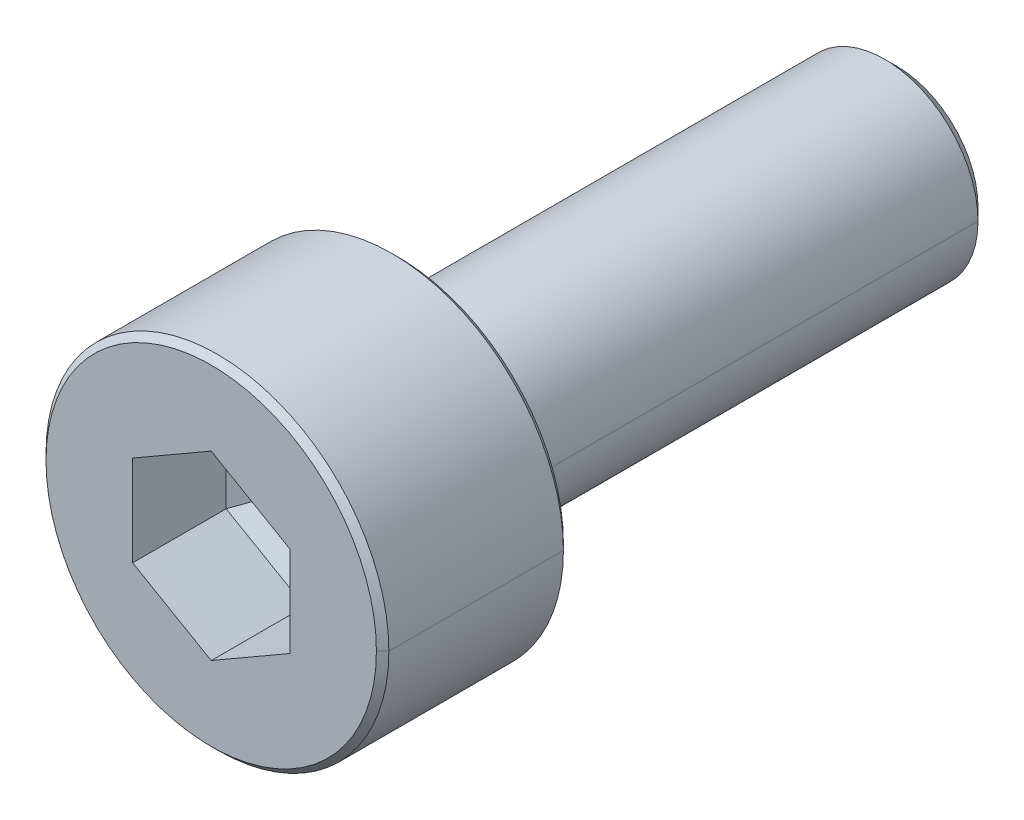
ISO-10303-21;
HEADER;
FILE_DESCRIPTION(('STEP AP214'),'2;1');
FILE_NAME('part.step','',(''),(''),'','','');
FILE_SCHEMA(('AUTOMOTIVE_DESIGN { 1 0 10303 214 1 1 1 1 }'));
ENDSEC;
DATA;
#1=APPLICATION_CONTEXT('core data for automotive mechanical design processes');
#2=APPLICATION_PROTOCOL_DEFINITION('international standard','automotive_design',2000,#1);
#3=PRODUCT_CONTEXT('',#1,'mechanical');
#4=PRODUCT('Part','Part','',(#3));
#5=PRODUCT_RELATED_PRODUCT_CATEGORY('part','',(#4));
#6=PRODUCT_DEFINITION_FORMATION('','',#4);
#7=PRODUCT_DEFINITION_CONTEXT('part definition',#1,'design');
#8=PRODUCT_DEFINITION('design','',#6,#7);
#9=PRODUCT_DEFINITION_SHAPE('','',#8);
#10=(LENGTH_UNIT() NAMED_UNIT(*) SI_UNIT(.MILLI.,.METRE.));
#11=(NAMED_UNIT(*) PLANE_ANGLE_UNIT() SI_UNIT($,.RADIAN.));
#12=(NAMED_UNIT(*) SI_UNIT($,.STERADIAN.) SOLID_ANGLE_UNIT());
#13=UNCERTAINTY_MEASURE_WITH_UNIT(LENGTH_MEASURE(1.E-05),#10,'distance_accuracy_value','');
#14=(GEOMETRIC_REPRESENTATION_CONTEXT(3) GLOBAL_UNCERTAINTY_ASSIGNED_CONTEXT((#13)) GLOBAL_UNIT_ASSIGNED_CONTEXT((#10,
#11,#12)) REPRESENTATION_CONTEXT('',''));
#15=CARTESIAN_POINT('',(0.,0.,0.));
#16=DIRECTION('',(0.,0.,1.));
#17=DIRECTION('',(1.,0.,0.));
#18=AXIS2_PLACEMENT_3D('',#15,#16,#17);
#19=CARTESIAN_POINT('',(0.,0.,8.));
#20=DIRECTION('',(0.,0.,1.));
#21=DIRECTION('',(1.,0.,0.));
#22=AXIS2_PLACEMENT_3D('',#19,#20,#21);
#23=CYLINDRICAL_SURFACE('',#22,2.75);
#24=DIRECTION('',(0.,0.,1.));
#25=VECTOR('',#24,1.);
#26=CARTESIAN_POINT('',(2.75000030173,5.595104737472E-10,8.099999698214));
#27=LINE('',#26,#25);
#28=CARTESIAN_POINT('',(2.75,0.,8.100000581692));
#29=VERTEX_POINT('',#28);
#30=CARTESIAN_POINT('',(2.75,0.,10.89999941831));
#31=VERTEX_POINT('',#30);
#32=EDGE_CURVE('E269',#29,#31,#27,.T.);
#33=ORIENTED_EDGE('',*,*,#32,.F.);
#34=CARTESIAN_POINT('',(0.,0.,8.100000581692));
#35=DIRECTION('',(0.,0.,-1.));
#36=DIRECTION('',(-1.,0.,0.));
#37=AXIS2_PLACEMENT_3D('',#34,#35,#36);
#38=CIRCLE('',#37,2.75);
#39=CARTESIAN_POINT('',(-2.75,0.,8.100000581692));
#40=VERTEX_POINT('',#39);
#41=EDGE_CURVE('E227',#40,#29,#38,.T.);
#42=ORIENTED_EDGE('',*,*,#41,.F.);
#43=DIRECTION('',(0.,0.,1.));
#44=VECTOR('',#43,1.);
#45=CARTESIAN_POINT('',(-2.75000030173,-5.595104746768E-10,8.099999698214));
#46=LINE('',#45,#44);
#47=CARTESIAN_POINT('',(-2.75,0.,10.89999941831));
#48=VERTEX_POINT('',#47);
#49=EDGE_CURVE('E299',#40,#48,#46,.T.);
#50=ORIENTED_EDGE('',*,*,#49,.T.);
#51=CARTESIAN_POINT('',(0.,0.,10.89999941831));
#52=DIRECTION('',(0.,0.,1.));
#53=DIRECTION('',(1.,0.,0.));
#54=AXIS2_PLACEMENT_3D('',#51,#52,#53);
#55=CIRCLE('',#54,2.75);
#56=EDGE_CURVE('E10',#31,#48,#55,.T.);
#57=ORIENTED_EDGE('',*,*,#56,.F.);
#58=EDGE_LOOP('',(#33,#42,#50,#57));
#59=FACE_BOUND('',#58,.T.);
#60=ADVANCED_FACE('F15',(#59),#23,.T.);
#61=CARTESIAN_POINT('',(0.,0.,10.95000050783));
#62=DIRECTION('',(0.,0.,-1.));
#63=DIRECTION('',(0.,-1.,0.));
#64=AXIS2_PLACEMENT_3D('',#61,#62,#63);
#65=CONICAL_SURFACE('',#64,2.700000677254,0.785398382857619);
#66=DIRECTION('',(0.707106173390536,-1.12696527626106E-09,-0.707107388982036));
#67=VECTOR('',#66,1.);
#68=CARTESIAN_POINT('',(2.650000387677,7.188872511511E-10,11.00000038775));
#69=LINE('',#68,#67);
#70=CARTESIAN_POINT('',(2.650000304246,0.,11.00000085889));
#71=VERTEX_POINT('',#70);
#72=EDGE_CURVE('E203',#71,#31,#69,.T.);
#73=ORIENTED_EDGE('',*,*,#72,.T.);
#74=ORIENTED_EDGE('',*,*,#56,.T.);
#75=DIRECTION('',(-0.707106173390536,1.12695886568306E-09,-0.707107388982036));
#76=VECTOR('',#75,1.);
#77=CARTESIAN_POINT('',(-2.650000387677,-7.188873169314E-10,11.00000038775));
#78=LINE('',#77,#76);
#79=CARTESIAN_POINT('',(-2.650000304246,0.,11.00000085889));
#80=VERTEX_POINT('',#79);
#81=EDGE_CURVE('E213',#80,#48,#78,.T.);
#82=ORIENTED_EDGE('',*,*,#81,.F.);
#83=CARTESIAN_POINT('',(0.,0.,11.00000085889));
#84=DIRECTION('',(0.,0.,1.));
#85=DIRECTION('',(1.,0.,0.));
#86=AXIS2_PLACEMENT_3D('',#83,#84,#85);
#87=CIRCLE('',#86,2.650000304246);
#88=EDGE_CURVE('E202',#71,#80,#87,.T.);
#89=ORIENTED_EDGE('',*,*,#88,.F.);
#90=EDGE_LOOP('',(#73,#74,#82,#89));
#91=FACE_BOUND('',#90,.T.);
#92=ADVANCED_FACE('F408',(#91),#65,.T.);
#93=CARTESIAN_POINT('',(0.,0.,8.75));
#94=DIRECTION('',(0.,0.,1.));
#95=DIRECTION('',(1.,0.,0.));
#96=AXIS2_PLACEMENT_3D('',#93,#94,#95);
#97=PLANE('',#96);
#98=DIRECTION('',(-0.866025403784429,0.500000000000017,0.));
#99=VECTOR('',#98,1.);
#100=CARTESIAN_POINT('',(0.08660254037844,0.05,8.75));
#101=LINE('',#100,#99);
#102=CARTESIAN_POINT('',(0.08660254037844,0.05,8.75));
#103=VERTEX_POINT('',#102);
#104=CARTESIAN_POINT('',(0.,0.1,8.75));
#105=VERTEX_POINT('',#104);
#106=EDGE_CURVE('E277',#103,#105,#101,.T.);
#107=ORIENTED_EDGE('',*,*,#106,.T.);
#108=DIRECTION('',(-0.866025403784429,-0.500000000000017,0.));
#109=VECTOR('',#108,1.);
#110=CARTESIAN_POINT('',(0.,0.1,8.75));
#111=LINE('',#110,#109);
#112=CARTESIAN_POINT('',(-0.08660254037844,0.05,8.75));
#113=VERTEX_POINT('',#112);
#114=EDGE_CURVE('E191',#105,#113,#111,.T.);
#115=ORIENTED_EDGE('',*,*,#114,.T.);
#116=DIRECTION('',(0.,-1.,0.));
#117=VECTOR('',#116,1.);
#118=CARTESIAN_POINT('',(-0.08660254037844,0.05,8.75));
#119=LINE('',#118,#117);
#120=CARTESIAN_POINT('',(-0.08660254037844,-0.05,8.75));
#121=VERTEX_POINT('',#120);
#122=EDGE_CURVE('E38',#113,#121,#119,.T.);
#123=ORIENTED_EDGE('',*,*,#122,.T.);
#124=DIRECTION('',(0.866025403784429,-0.500000000000017,0.));
#125=VECTOR('',#124,1.);
#126=CARTESIAN_POINT('',(-0.08660254037844,-0.05,8.75));
#127=LINE('',#126,#125);
#128=CARTESIAN_POINT('',(0.,-0.1,8.75));
#129=VERTEX_POINT('',#128);
#130=EDGE_CURVE('E221',#121,#129,#127,.T.);
#131=ORIENTED_EDGE('',*,*,#130,.T.);
#132=DIRECTION('',(0.866025403784429,0.500000000000017,0.));
#133=VECTOR('',#132,1.);
#134=CARTESIAN_POINT('',(0.,-0.1,8.75));
#135=LINE('',#134,#133);
#136=CARTESIAN_POINT('',(0.08660254037844,-0.05,8.75));
#137=VERTEX_POINT('',#136);
#138=EDGE_CURVE('E197',#129,#137,#135,.T.);
#139=ORIENTED_EDGE('',*,*,#138,.T.);
#140=DIRECTION('',(0.,1.,0.));
#141=VECTOR('',#140,1.);
#142=CARTESIAN_POINT('',(0.08660254037844,-0.05,8.75));
#143=LINE('',#142,#141);
#144=EDGE_CURVE('E244',#137,#103,#143,.T.);
#145=ORIENTED_EDGE('',*,*,#144,.T.);
#146=EDGE_LOOP('',(#107,#115,#123,#131,#139,#145));
#147=FACE_BOUND('',#146,.T.);
#148=ADVANCED_FACE('F413',(#147),#97,.T.);
#149=CARTESIAN_POINT('',(-1.26,0.7274613391789,11.));
#150=DIRECTION('',(-1.,0.,0.));
#151=DIRECTION('',(0.,0.,1.));
#152=AXIS2_PLACEMENT_3D('',#149,#150,#151);
#153=PLANE('',#152);
#154=DIRECTION('',(0.,0.,-1.));
#155=VECTOR('',#154,1.);
#156=CARTESIAN_POINT('',(-1.26,0.7274613391789,11.));
#157=LINE('',#156,#155);
#158=CARTESIAN_POINT('',(-1.26,0.7274613391789,11.));
#159=VERTEX_POINT('',#158);
#160=CARTESIAN_POINT('',(-1.26,0.7274613391789,9.5));
#161=VERTEX_POINT('',#160);
#162=EDGE_CURVE('E149',#159,#161,#157,.T.);
#163=ORIENTED_EDGE('',*,*,#162,.F.);
#164=DIRECTION('',(0.,-1.,0.));
#165=VECTOR('',#164,1.);
#166=CARTESIAN_POINT('',(-1.26,0.7274613391789,11.));
#167=LINE('',#166,#165);
#168=CARTESIAN_POINT('',(-1.26,-0.7274613391789,11.));
#169=VERTEX_POINT('',#168);
#170=EDGE_CURVE('E154',#159,#169,#167,.T.);
#171=ORIENTED_EDGE('',*,*,#170,.T.);
#172=DIRECTION('',(0.,0.,-1.));
#173=VECTOR('',#172,1.);
#174=CARTESIAN_POINT('',(-1.26,-0.7274613391789,11.));
#175=LINE('',#174,#173);
#176=CARTESIAN_POINT('',(-1.26,-0.7274613391789,9.5));
#177=VERTEX_POINT('',#176);
#178=EDGE_CURVE('E222',#169,#177,#175,.T.);
#179=ORIENTED_EDGE('',*,*,#178,.T.);
#180=DIRECTION('',(0.,-1.,0.));
#181=VECTOR('',#180,1.);
#182=CARTESIAN_POINT('',(-1.26,0.7274613391789,9.5));
#183=LINE('',#182,#181);
#184=EDGE_CURVE('E25',#161,#177,#183,.T.);
#185=ORIENTED_EDGE('',*,*,#184,.F.);
#186=EDGE_LOOP('',(#163,#171,#179,#185));
#187=FACE_BOUND('',#186,.T.);
#188=ADVANCED_FACE('F151',(#187),#153,.F.);
#189=CARTESIAN_POINT('',(-0.6733012701892,0.,9.125));
#190=DIRECTION('',(-0.538557238596109,0.,-0.842588927506013));
#191=DIRECTION('',(-0.842588927506013,0.,0.538557238596109));
#192=AXIS2_PLACEMENT_3D('',#189,#190,#191);
#193=PLANE('',#192);
#194=DIRECTION('',(-0.757690757673019,-0.437452962905011,0.484292908251312));
#195=VECTOR('',#194,1.);
#196=CARTESIAN_POINT('',(-0.08660254037844,-0.05,8.75));
#197=LINE('',#196,#195);
#198=EDGE_CURVE('E276',#121,#177,#197,.T.);
#199=ORIENTED_EDGE('',*,*,#198,.F.);
#200=ORIENTED_EDGE('',*,*,#122,.F.);
#201=DIRECTION('',(-0.757690757673019,0.437452962905011,0.484292908251312));
#202=VECTOR('',#201,1.);
#203=CARTESIAN_POINT('',(-0.08660254037844,0.05,8.75));
#204=LINE('',#203,#202);
#205=EDGE_CURVE('E188',#113,#161,#204,.T.);
#206=ORIENTED_EDGE('',*,*,#205,.T.);
#207=ORIENTED_EDGE('',*,*,#184,.T.);
#208=EDGE_LOOP('',(#199,#200,#206,#207));
#209=FACE_BOUND('',#208,.T.);
#210=ADVANCED_FACE('F467',(#209),#193,.F.);
#211=CARTESIAN_POINT('',(-0.3366506350946,-0.5830960043842,9.125));
#212=DIRECTION('',(-0.269278619298103,-0.466404250016206,-0.84258892750601));
#213=DIRECTION('',(0.,-0.874905925810061,0.484292908251236));
#214=AXIS2_PLACEMENT_3D('',#211,#212,#213);
#215=PLANE('',#214);
#216=DIRECTION('',(0.,-0.87490592581002,0.484292908251311));
#217=VECTOR('',#216,1.);
#218=CARTESIAN_POINT('',(0.,-0.1,8.75));
#219=LINE('',#218,#217);
#220=CARTESIAN_POINT('',(0.,-1.454922678358,9.5));
#221=VERTEX_POINT('',#220);
#222=EDGE_CURVE('E192',#129,#221,#219,.T.);
#223=ORIENTED_EDGE('',*,*,#222,.F.);
#224=ORIENTED_EDGE('',*,*,#130,.F.);
#225=ORIENTED_EDGE('',*,*,#198,.T.);
#226=DIRECTION('',(0.866025403784429,-0.500000000000017,0.));
#227=VECTOR('',#226,1.);
#228=CARTESIAN_POINT('',(-1.26,-0.7274613391789,9.5));
#229=LINE('',#228,#227);
#230=EDGE_CURVE('E218',#177,#221,#229,.T.);
#231=ORIENTED_EDGE('',*,*,#230,.T.);
#232=EDGE_LOOP('',(#223,#224,#225,#231));
#233=FACE_BOUND('',#232,.T.);
#234=ADVANCED_FACE('F470',(#233),#215,.F.);
#235=CARTESIAN_POINT('',(-1.26,-0.7274613391789,11.));
#236=DIRECTION('',(-0.500000000000017,-0.866025403784429,0.));
#237=DIRECTION('',(-0.866025403784429,0.500000000000017,0.));
#238=AXIS2_PLACEMENT_3D('',#235,#236,#237);
#239=PLANE('',#238);
#240=ORIENTED_EDGE('',*,*,#178,.F.);
#241=DIRECTION('',(0.866025403784429,-0.500000000000017,0.));
#242=VECTOR('',#241,1.);
#243=CARTESIAN_POINT('',(-1.26,-0.7274613391789,11.));
#244=LINE('',#243,#242);
#245=CARTESIAN_POINT('',(0.,-1.454922678358,11.));
#246=VERTEX_POINT('',#245);
#247=EDGE_CURVE('E176',#169,#246,#244,.T.);
#248=ORIENTED_EDGE('',*,*,#247,.T.);
#249=DIRECTION('',(0.,0.,-1.));
#250=VECTOR('',#249,1.);
#251=CARTESIAN_POINT('',(0.,-1.454922678358,11.));
#252=LINE('',#251,#250);
#253=EDGE_CURVE('E284',#246,#221,#252,.T.);
#254=ORIENTED_EDGE('',*,*,#253,.T.);
#255=ORIENTED_EDGE('',*,*,#230,.F.);
#256=EDGE_LOOP('',(#240,#248,#254,#255));
#257=FACE_BOUND('',#256,.T.);
#258=ADVANCED_FACE('F478',(#257),#239,.F.);
#259=CARTESIAN_POINT('',(0.,-1.454922678358,11.));
#260=DIRECTION('',(0.500000000000017,-0.866025403784429,0.));
#261=DIRECTION('',(0.,0.,-1.));
#262=AXIS2_PLACEMENT_3D('',#259,#260,#261);
#263=PLANE('',#262);
#264=ORIENTED_EDGE('',*,*,#253,.F.);
#265=DIRECTION('',(0.866025403784429,0.500000000000017,0.));
#266=VECTOR('',#265,1.);
#267=CARTESIAN_POINT('',(0.,-1.454922678358,11.));
#268=LINE('',#267,#266);
#269=CARTESIAN_POINT('',(1.26,-0.7274613391789,11.));
#270=VERTEX_POINT('',#269);
#271=EDGE_CURVE('E182',#246,#270,#268,.T.);
#272=ORIENTED_EDGE('',*,*,#271,.T.);
#273=DIRECTION('',(0.,0.,-1.));
#274=VECTOR('',#273,1.);
#275=CARTESIAN_POINT('',(1.26,-0.7274613391789,11.));
#276=LINE('',#275,#274);
#277=CARTESIAN_POINT('',(1.26,-0.7274613391789,9.5));
#278=VERTEX_POINT('',#277);
#279=EDGE_CURVE('E265',#270,#278,#276,.T.);
#280=ORIENTED_EDGE('',*,*,#279,.T.);
#281=DIRECTION('',(0.866025403784429,0.500000000000017,0.));
#282=VECTOR('',#281,1.);
#283=CARTESIAN_POINT('',(0.,-1.454922678358,9.5));
#284=LINE('',#283,#282);
#285=EDGE_CURVE('E196',#221,#278,#284,.T.);
#286=ORIENTED_EDGE('',*,*,#285,.F.);
#287=EDGE_LOOP('',(#264,#272,#280,#286));
#288=FACE_BOUND('',#287,.T.);
#289=ADVANCED_FACE('F458',(#288),#263,.F.);
#290=CARTESIAN_POINT('',(0.3366506350946,-0.5830960043842,9.125));
#291=DIRECTION('',(0.269278619298103,-0.466404250016206,-0.84258892750601));
#292=DIRECTION('',(0.,-0.874905925810061,0.484292908251236));
#293=AXIS2_PLACEMENT_3D('',#290,#291,#292);
#294=PLANE('',#293);
#295=DIRECTION('',(0.757690757673019,-0.437452962905011,0.484292908251312));
#296=VECTOR('',#295,1.);
#297=CARTESIAN_POINT('',(0.08660254037844,-0.05,8.75));
#298=LINE('',#297,#296);
#299=EDGE_CURVE('E240',#137,#278,#298,.T.);
#300=ORIENTED_EDGE('',*,*,#299,.F.);
#301=ORIENTED_EDGE('',*,*,#138,.F.);
#302=ORIENTED_EDGE('',*,*,#222,.T.);
#303=ORIENTED_EDGE('',*,*,#285,.T.);
#304=EDGE_LOOP('',(#300,#301,#302,#303));
#305=FACE_BOUND('',#304,.T.);
#306=ADVANCED_FACE('F455',(#305),#294,.F.);
#307=CARTESIAN_POINT('',(0.6733012701892,0.,9.125));
#308=DIRECTION('',(0.538557238596109,0.,-0.842588927506013));
#309=DIRECTION('',(0.,-1.,0.));
#310=AXIS2_PLACEMENT_3D('',#307,#308,#309);
#311=PLANE('',#310);
#312=DIRECTION('',(0.757690757673019,0.437452962905011,0.484292908251312));
#313=VECTOR('',#312,1.);
#314=CARTESIAN_POINT('',(0.08660254037844,0.05,8.75));
#315=LINE('',#314,#313);
#316=CARTESIAN_POINT('',(1.26,0.7274613391789,9.5));
#317=VERTEX_POINT('',#316);
#318=EDGE_CURVE('E280',#103,#317,#315,.T.);
#319=ORIENTED_EDGE('',*,*,#318,.F.);
#320=ORIENTED_EDGE('',*,*,#144,.F.);
#321=ORIENTED_EDGE('',*,*,#299,.T.);
#322=DIRECTION('',(0.,1.,0.));
#323=VECTOR('',#322,1.);
#324=CARTESIAN_POINT('',(1.26,-0.7274613391789,9.5));
#325=LINE('',#324,#323);
#326=EDGE_CURVE('E273',#278,#317,#325,.T.);
#327=ORIENTED_EDGE('',*,*,#326,.T.);
#328=EDGE_LOOP('',(#319,#320,#321,#327));
#329=FACE_BOUND('',#328,.T.);
#330=ADVANCED_FACE('F457',(#329),#311,.F.);
#331=CARTESIAN_POINT('',(1.26,-0.7274613391789,11.));
#332=DIRECTION('',(1.,0.,0.));
#333=DIRECTION('',(0.,1.,0.));
#334=AXIS2_PLACEMENT_3D('',#331,#332,#333);
#335=PLANE('',#334);
#336=ORIENTED_EDGE('',*,*,#279,.F.);
#337=DIRECTION('',(0.,1.,0.));
#338=VECTOR('',#337,1.);
#339=CARTESIAN_POINT('',(1.26,-0.7274613391789,11.));
#340=LINE('',#339,#338);
#341=CARTESIAN_POINT('',(1.26,0.7274613391789,11.));
#342=VERTEX_POINT('',#341);
#343=EDGE_CURVE('E212',#270,#342,#340,.T.);
#344=ORIENTED_EDGE('',*,*,#343,.T.);
#345=DIRECTION('',(0.,0.,-1.));
#346=VECTOR('',#345,1.);
#347=CARTESIAN_POINT('',(1.26,0.7274613391789,11.));
#348=LINE('',#347,#346);
#349=EDGE_CURVE('E294',#342,#317,#348,.T.);
#350=ORIENTED_EDGE('',*,*,#349,.T.);
#351=ORIENTED_EDGE('',*,*,#326,.F.);
#352=EDGE_LOOP('',(#336,#344,#350,#351));
#353=FACE_BOUND('',#352,.T.);
#354=ADVANCED_FACE('F449',(#353),#335,.F.);
#355=CARTESIAN_POINT('',(1.26,0.7274613391789,11.));
#356=DIRECTION('',(0.500000000000017,0.866025403784429,0.));
#357=DIRECTION('',(0.,0.,-1.));
#358=AXIS2_PLACEMENT_3D('',#355,#356,#357);
#359=PLANE('',#358);
#360=ORIENTED_EDGE('',*,*,#349,.F.);
#361=DIRECTION('',(-0.866025403784429,0.500000000000017,0.));
#362=VECTOR('',#361,1.);
#363=CARTESIAN_POINT('',(1.26,0.7274613391789,11.));
#364=LINE('',#363,#362);
#365=CARTESIAN_POINT('',(0.,1.454922678358,11.));
#366=VERTEX_POINT('',#365);
#367=EDGE_CURVE('E229',#342,#366,#364,.T.);
#368=ORIENTED_EDGE('',*,*,#367,.T.);
#369=DIRECTION('',(0.,0.,-1.));
#370=VECTOR('',#369,1.);
#371=CARTESIAN_POINT('',(0.,1.454922678358,11.));
#372=LINE('',#371,#370);
#373=CARTESIAN_POINT('',(0.,1.454922678358,9.5));
#374=VERTEX_POINT('',#373);
#375=EDGE_CURVE('E161',#366,#374,#372,.T.);
#376=ORIENTED_EDGE('',*,*,#375,.T.);
#377=DIRECTION('',(-0.866025403784429,0.500000000000017,0.));
#378=VECTOR('',#377,1.);
#379=CARTESIAN_POINT('',(1.26,0.7274613391789,9.5));
#380=LINE('',#379,#378);
#381=EDGE_CURVE('E292',#317,#374,#380,.T.);
#382=ORIENTED_EDGE('',*,*,#381,.F.);
#383=EDGE_LOOP('',(#360,#368,#376,#382));
#384=FACE_BOUND('',#383,.T.);
#385=ADVANCED_FACE('F423',(#384),#359,.F.);
#386=CARTESIAN_POINT('',(0.3366506350946,0.5830960043842,9.125));
#387=DIRECTION('',(0.269278619298103,0.466404250016206,-0.84258892750601));
#388=DIRECTION('',(-0.952538880218884,0.,-0.30441695365297));
#389=AXIS2_PLACEMENT_3D('',#386,#387,#388);
#390=PLANE('',#389);
#391=DIRECTION('',(0.,0.87490592581002,0.484292908251311));
#392=VECTOR('',#391,1.);
#393=CARTESIAN_POINT('',(0.,0.1,8.75));
#394=LINE('',#393,#392);
#395=EDGE_CURVE('E281',#105,#374,#394,.T.);
#396=ORIENTED_EDGE('',*,*,#395,.F.);
#397=ORIENTED_EDGE('',*,*,#106,.F.);
#398=ORIENTED_EDGE('',*,*,#318,.T.);
#399=ORIENTED_EDGE('',*,*,#381,.T.);
#400=EDGE_LOOP('',(#396,#397,#398,#399));
#401=FACE_BOUND('',#400,.T.);
#402=ADVANCED_FACE('F420',(#401),#390,.F.);
#403=CARTESIAN_POINT('',(-0.3366506350946,0.5830960043842,9.125));
#404=DIRECTION('',(-0.269278619298103,0.466404250016206,-0.84258892750601));
#405=DIRECTION('',(-0.952538880218884,0.,0.30441695365297));
#406=AXIS2_PLACEMENT_3D('',#403,#404,#405);
#407=PLANE('',#406);
#408=ORIENTED_EDGE('',*,*,#205,.F.);
#409=ORIENTED_EDGE('',*,*,#114,.F.);
#410=ORIENTED_EDGE('',*,*,#395,.T.);
#411=DIRECTION('',(-0.866025403784429,-0.500000000000017,0.));
#412=VECTOR('',#411,1.);
#413=CARTESIAN_POINT('',(0.,1.454922678358,9.5));
#414=LINE('',#413,#412);
#415=EDGE_CURVE('E160',#374,#161,#414,.T.);
#416=ORIENTED_EDGE('',*,*,#415,.T.);
#417=EDGE_LOOP('',(#408,#409,#410,#416));
#418=FACE_BOUND('',#417,.T.);
#419=ADVANCED_FACE('F422',(#418),#407,.F.);
#420=CARTESIAN_POINT('',(0.,1.454922678358,11.));
#421=DIRECTION('',(-0.500000000000017,0.866025403784429,0.));
#422=DIRECTION('',(0.,0.,1.));
#423=AXIS2_PLACEMENT_3D('',#420,#421,#422);
#424=PLANE('',#423);
#425=ORIENTED_EDGE('',*,*,#375,.F.);
#426=DIRECTION('',(-0.866025403784429,-0.500000000000017,0.));
#427=VECTOR('',#426,1.);
#428=CARTESIAN_POINT('',(0.,1.454922678358,11.));
#429=LINE('',#428,#427);
#430=EDGE_CURVE('E164',#366,#159,#429,.T.);
#431=ORIENTED_EDGE('',*,*,#430,.T.);
#432=ORIENTED_EDGE('',*,*,#162,.T.);
#433=ORIENTED_EDGE('',*,*,#415,.F.);
#434=EDGE_LOOP('',(#425,#431,#432,#433));
#435=FACE_BOUND('',#434,.T.);
#436=ADVANCED_FACE('F165',(#435),#424,.F.);
#437=CARTESIAN_POINT('',(0.,0.,11.));
#438=DIRECTION('',(0.,0.,1.));
#439=DIRECTION('',(1.,0.,0.));
#440=AXIS2_PLACEMENT_3D('',#437,#438,#439);
#441=PLANE('',#440);
#442=ORIENTED_EDGE('',*,*,#367,.F.);
#443=ORIENTED_EDGE('',*,*,#343,.F.);
#444=ORIENTED_EDGE('',*,*,#271,.F.);
#445=ORIENTED_EDGE('',*,*,#247,.F.);
#446=ORIENTED_EDGE('',*,*,#170,.F.);
#447=ORIENTED_EDGE('',*,*,#430,.F.);
#448=EDGE_LOOP('',(#442,#443,#444,#445,#446,#447));
#449=FACE_BOUND('',#448,.T.);
#450=CARTESIAN_POINT('',(0.,0.,11.00000085889));
#451=DIRECTION('',(0.,0.,1.));
#452=DIRECTION('',(-1.,0.,0.));
#453=AXIS2_PLACEMENT_3D('',#450,#451,#452);
#454=CIRCLE('',#453,2.650000304246);
#455=EDGE_CURVE('E198',#80,#71,#454,.T.);
#456=ORIENTED_EDGE('',*,*,#455,.T.);
#457=ORIENTED_EDGE('',*,*,#88,.T.);
#458=EDGE_LOOP('',(#456,#457));
#459=FACE_BOUND('',#458,.T.);
#460=ADVANCED_FACE('F172',(#449,#459),#441,.T.);
#461=CARTESIAN_POINT('',(0.,0.,10.95000050783));
#462=DIRECTION('',(0.,0.,-1.));
#463=DIRECTION('',(0.,-1.,0.));
#464=AXIS2_PLACEMENT_3D('',#461,#462,#463);
#465=CONICAL_SURFACE('',#464,2.700000677254,0.785398382857619);
#466=ORIENTED_EDGE('',*,*,#81,.T.);
#467=CARTESIAN_POINT('',(0.,0.,10.89999941831));
#468=DIRECTION('',(0.,0.,1.));
#469=DIRECTION('',(-1.,0.,0.));
#470=AXIS2_PLACEMENT_3D('',#467,#468,#469);
#471=CIRCLE('',#470,2.75);
#472=EDGE_CURVE('E217',#48,#31,#471,.T.);
#473=ORIENTED_EDGE('',*,*,#472,.T.);
#474=ORIENTED_EDGE('',*,*,#72,.F.);
#475=ORIENTED_EDGE('',*,*,#455,.F.);
#476=EDGE_LOOP('',(#466,#473,#474,#475));
#477=FACE_BOUND('',#476,.T.);
#478=ADVANCED_FACE('F426',(#477),#465,.T.);
#479=CARTESIAN_POINT('',(0.,0.,8.));
#480=DIRECTION('',(0.,0.,1.));
#481=DIRECTION('',(1.,0.,0.));
#482=AXIS2_PLACEMENT_3D('',#479,#480,#481);
#483=CYLINDRICAL_SURFACE('',#482,2.75);
#484=ORIENTED_EDGE('',*,*,#49,.F.);
#485=CARTESIAN_POINT('',(0.,0.,8.100000581692));
#486=DIRECTION('',(0.,0.,-1.));
#487=DIRECTION('',(1.,0.,0.));
#488=AXIS2_PLACEMENT_3D('',#485,#486,#487);
#489=CIRCLE('',#488,2.75);
#490=EDGE_CURVE('E348',#29,#40,#489,.T.);
#491=ORIENTED_EDGE('',*,*,#490,.F.);
#492=ORIENTED_EDGE('',*,*,#32,.T.);
#493=ORIENTED_EDGE('',*,*,#472,.F.);
#494=EDGE_LOOP('',(#484,#491,#492,#493));
#495=FACE_BOUND('',#494,.T.);
#496=ADVANCED_FACE('F431',(#495),#483,.T.);
#497=CARTESIAN_POINT('',(0.,0.,8.049999492168));
#498=DIRECTION('',(0.,0.,1.));
#499=DIRECTION('',(0.,-1.,0.));
#500=AXIS2_PLACEMENT_3D('',#497,#498,#499);
#501=CONICAL_SURFACE('',#500,2.700000677254,0.785398382857619);
#502=DIRECTION('',(0.707106173390536,-1.12696290149606E-09,0.707107388982036));
#503=VECTOR('',#502,1.);
#504=CARTESIAN_POINT('',(2.650000387677,7.188870957186E-10,7.999999612251));
#505=LINE('',#504,#503);
#506=CARTESIAN_POINT('',(2.650000304246,0.,7.999999141106));
#507=VERTEX_POINT('',#506);
#508=EDGE_CURVE('E344',#507,#29,#505,.T.);
#509=ORIENTED_EDGE('',*,*,#508,.T.);
#510=ORIENTED_EDGE('',*,*,#490,.T.);
#511=DIRECTION('',(-0.707106173390536,1.12695446272406E-09,0.707107388982036));
#512=VECTOR('',#511,1.);
#513=CARTESIAN_POINT('',(-2.650000387677,-7.188859032258E-10,7.999999612251));
#514=LINE('',#513,#512);
#515=CARTESIAN_POINT('',(-2.650000304246,0.,7.999999141106));
#516=VERTEX_POINT('',#515);
#517=EDGE_CURVE('E223',#516,#40,#514,.T.);
#518=ORIENTED_EDGE('',*,*,#517,.F.);
#519=CARTESIAN_POINT('',(0.,0.,7.999999141106));
#520=DIRECTION('',(0.,0.,-1.));
#521=DIRECTION('',(1.,0.,0.));
#522=AXIS2_PLACEMENT_3D('',#519,#520,#521);
#523=CIRCLE('',#522,2.650000304246);
#524=EDGE_CURVE('E247',#507,#516,#523,.T.);
#525=ORIENTED_EDGE('',*,*,#524,.F.);
#526=EDGE_LOOP('',(#509,#510,#518,#525));
#527=FACE_BOUND('',#526,.T.);
#528=ADVANCED_FACE('F453',(#527),#501,.T.);
#529=CARTESIAN_POINT('',(0.,0.,8.049999492168));
#530=DIRECTION('',(0.,0.,1.));
#531=DIRECTION('',(0.,-1.,0.));
#532=AXIS2_PLACEMENT_3D('',#529,#530,#531);
#533=CONICAL_SURFACE('',#532,2.700000677254,0.785398382857619);
#534=ORIENTED_EDGE('',*,*,#517,.T.);
#535=ORIENTED_EDGE('',*,*,#41,.T.);
#536=ORIENTED_EDGE('',*,*,#508,.F.);
#537=CARTESIAN_POINT('',(0.,0.,7.999999141106));
#538=DIRECTION('',(0.,0.,-1.));
#539=DIRECTION('',(-1.,0.,0.));
#540=AXIS2_PLACEMENT_3D('',#537,#538,#539);
#541=CIRCLE('',#540,2.650000304246);
#542=EDGE_CURVE('E228',#516,#507,#541,.T.);
#543=ORIENTED_EDGE('',*,*,#542,.F.);
#544=EDGE_LOOP('',(#534,#535,#536,#543));
#545=FACE_BOUND('',#544,.T.);
#546=ADVANCED_FACE('F17',(#545),#533,.T.);
#547=CARTESIAN_POINT('',(0.,0.,8.));
#548=DIRECTION('',(0.,0.,1.));
#549=DIRECTION('',(1.,0.,0.));
#550=AXIS2_PLACEMENT_3D('',#547,#548,#549);
#551=PLANE('',#550);
#552=CARTESIAN_POINT('',(0.,0.,8.));
#553=DIRECTION('',(0.,0.,1.));
#554=DIRECTION('',(-1.,0.,0.));
#555=AXIS2_PLACEMENT_3D('',#552,#553,#554);
#556=CIRCLE('',#555,1.5);
#557=CARTESIAN_POINT('',(-1.5,0.,8.));
#558=VERTEX_POINT('',#557);
#559=CARTESIAN_POINT('',(1.5,0.,8.));
#560=VERTEX_POINT('',#559);
#561=EDGE_CURVE('E239',#558,#560,#556,.T.);
#562=ORIENTED_EDGE('',*,*,#561,.T.);
#563=CARTESIAN_POINT('',(0.,0.,8.));
#564=DIRECTION('',(0.,0.,1.));
#565=DIRECTION('',(1.,0.,0.));
#566=AXIS2_PLACEMENT_3D('',#563,#564,#565);
#567=CIRCLE('',#566,1.5);
#568=EDGE_CURVE('E238',#560,#558,#567,.T.);
#569=ORIENTED_EDGE('',*,*,#568,.T.);
#570=EDGE_LOOP('',(#562,#569));
#571=FACE_BOUND('',#570,.T.);
#572=ORIENTED_EDGE('',*,*,#524,.T.);
#573=ORIENTED_EDGE('',*,*,#542,.T.);
#574=EDGE_LOOP('',(#572,#573));
#575=FACE_BOUND('',#574,.T.);
#576=ADVANCED_FACE('F443',(#571,#575),#551,.F.);
#577=CARTESIAN_POINT('',(0.,0.,0.));
#578=DIRECTION('',(0.,0.,1.));
#579=DIRECTION('',(1.,0.,0.));
#580=AXIS2_PLACEMENT_3D('',#577,#578,#579);
#581=CYLINDRICAL_SURFACE('',#580,1.5);
#582=DIRECTION('',(-1.22029451615299E-07,4.04733666545197E-11,1.));
#583=VECTOR('',#582,1.);
#584=CARTESIAN_POINT('',(-1.49999904817,-3.156920376902E-10,0.2000009516869));
#585=LINE('',#584,#583);
#586=CARTESIAN_POINT('',(-1.5,0.,0.2000008183637));
#587=VERTEX_POINT('',#586);
#588=EDGE_CURVE('E234',#587,#558,#585,.T.);
#589=ORIENTED_EDGE('',*,*,#588,.T.);
#590=ORIENTED_EDGE('',*,*,#568,.F.);
#591=DIRECTION('',(1.22029451615299E-07,-4.04733981299897E-11,1.));
#592=VECTOR('',#591,1.);
#593=CARTESIAN_POINT('',(1.49999904817,3.156922831989E-10,0.2000009516869));
#594=LINE('',#593,#592);
#595=CARTESIAN_POINT('',(1.5,0.,0.2000008183637));
#596=VERTEX_POINT('',#595);
#597=EDGE_CURVE('E285',#596,#560,#594,.T.);
#598=ORIENTED_EDGE('',*,*,#597,.F.);
#599=CARTESIAN_POINT('',(0.,0.,0.2000008183637));
#600=DIRECTION('',(0.,0.,-1.));
#601=DIRECTION('',(-1.,0.,0.));
#602=AXIS2_PLACEMENT_3D('',#599,#600,#601);
#603=CIRCLE('',#602,1.5);
#604=EDGE_CURVE('E208',#587,#596,#603,.T.);
#605=ORIENTED_EDGE('',*,*,#604,.F.);
#606=EDGE_LOOP('',(#589,#590,#598,#605));
#607=FACE_BOUND('',#606,.T.);
#608=ADVANCED_FACE('F392',(#607),#581,.T.);
#609=CARTESIAN_POINT('',(0.,0.,0.));
#610=DIRECTION('',(0.,0.,1.));
#611=DIRECTION('',(1.,0.,0.));
#612=AXIS2_PLACEMENT_3D('',#609,#610,#611);
#613=CYLINDRICAL_SURFACE('',#612,1.5);
#614=ORIENTED_EDGE('',*,*,#597,.T.);
#615=ORIENTED_EDGE('',*,*,#561,.F.);
#616=ORIENTED_EDGE('',*,*,#588,.F.);
#617=CARTESIAN_POINT('',(0.,0.,0.2000008183637));
#618=DIRECTION('',(0.,0.,-1.));
#619=DIRECTION('',(1.,0.,0.));
#620=AXIS2_PLACEMENT_3D('',#617,#618,#619);
#621=CIRCLE('',#620,1.5);
#622=EDGE_CURVE('E289',#596,#587,#621,.T.);
#623=ORIENTED_EDGE('',*,*,#622,.F.);
#624=EDGE_LOOP('',(#614,#615,#616,#623));
#625=FACE_BOUND('',#624,.T.);
#626=ADVANCED_FACE('F418',(#625),#613,.T.);
#627=CARTESIAN_POINT('',(0.,0.,0.1000020696051));
#628=DIRECTION('',(0.,0.,1.));
#629=DIRECTION('',(0.,-1.,0.));
#630=AXIS2_PLACEMENT_3D('',#627,#628,#629);
#631=CONICAL_SURFACE('',#630,1.399998516373,0.785396894386203);
#632=DIRECTION('',(0.707107304626704,-1.73622395166601E-10,0.707106257746004));
#633=VECTOR('',#632,1.);
#634=CARTESIAN_POINT('',(1.299998900108,3.648001123969E-10,1.099727126549E-06));
#635=LINE('',#634,#633);
#636=CARTESIAN_POINT('',(1.29999800045,0.,1.299878002126E-06));
#637=VERTEX_POINT('',#636);
#638=EDGE_CURVE('E327',#637,#596,#635,.T.);
#639=ORIENTED_EDGE('',*,*,#638,.T.);
#640=ORIENTED_EDGE('',*,*,#622,.T.);
#641=DIRECTION('',(-0.707107304626704,1.73621675550801E-10,0.707106257746004));
#642=VECTOR('',#641,1.);
#643=CARTESIAN_POINT('',(-1.299998900108,-3.647996633501E-10,1.099727126253E-06));
#644=LINE('',#643,#642);
#645=CARTESIAN_POINT('',(-1.29999800045,0.,1.299878002126E-06));
#646=VERTEX_POINT('',#645);
#647=EDGE_CURVE('E204',#646,#587,#644,.T.);
#648=ORIENTED_EDGE('',*,*,#647,.F.);
#649=CARTESIAN_POINT('',(0.,0.,1.299878002126E-06));
#650=DIRECTION('',(0.,0.,-1.));
#651=DIRECTION('',(1.,0.,0.));
#652=AXIS2_PLACEMENT_3D('',#649,#650,#651);
#653=CIRCLE('',#652,1.29999800045);
#654=EDGE_CURVE('E379',#637,#646,#653,.T.);
#655=ORIENTED_EDGE('',*,*,#654,.F.);
#656=EDGE_LOOP('',(#639,#640,#648,#655));
#657=FACE_BOUND('',#656,.T.);
#658=ADVANCED_FACE('F387',(#657),#631,.T.);
#659=CARTESIAN_POINT('',(0.,0.,0.1000020696051));
#660=DIRECTION('',(0.,0.,1.));
#661=DIRECTION('',(0.,-1.,0.));
#662=AXIS2_PLACEMENT_3D('',#659,#660,#661);
#663=CONICAL_SURFACE('',#662,1.399998516373,0.785396894386203);
#664=ORIENTED_EDGE('',*,*,#647,.T.);
#665=ORIENTED_EDGE('',*,*,#604,.T.);
#666=ORIENTED_EDGE('',*,*,#638,.F.);
#667=CARTESIAN_POINT('',(0.,0.,1.299878002126E-06));
#668=DIRECTION('',(0.,0.,-1.));
#669=DIRECTION('',(-1.,0.,0.));
#670=AXIS2_PLACEMENT_3D('',#667,#668,#669);
#671=CIRCLE('',#670,1.29999800045);
#672=EDGE_CURVE('E185',#646,#637,#671,.T.);
#673=ORIENTED_EDGE('',*,*,#672,.F.);
#674=EDGE_LOOP('',(#664,#665,#666,#673));
#675=FACE_BOUND('',#674,.T.);
#676=ADVANCED_FACE('F395',(#675),#663,.T.);
#677=CARTESIAN_POINT('',(0.,0.,0.));
#678=DIRECTION('',(0.,0.,1.));
#679=DIRECTION('',(1.,0.,0.));
#680=AXIS2_PLACEMENT_3D('',#677,#678,#679);
#681=PLANE('',#680);
#682=ORIENTED_EDGE('',*,*,#654,.T.);
#683=ORIENTED_EDGE('',*,*,#672,.T.);
#684=EDGE_LOOP('',(#682,#683));
#685=FACE_BOUND('',#684,.T.);
#686=ADVANCED_FACE('F398',(#685),#681,.F.);
#687=CLOSED_SHELL('',(#60,#92,#148,#188,#210,#234,#258,#289,#306,#330,#354,#385,#402,#419,#436,
#460,#478,#496,#528,#546,#576,#608,#626,#658,#676,#686));
#688=MANIFOLD_SOLID_BREP('B1',#687);
#689=ADVANCED_BREP_SHAPE_REPRESENTATION('',(#18,#688),#14);
#690=SHAPE_DEFINITION_REPRESENTATION(#9,#689);
ENDSEC;
END-ISO-10303-21;
